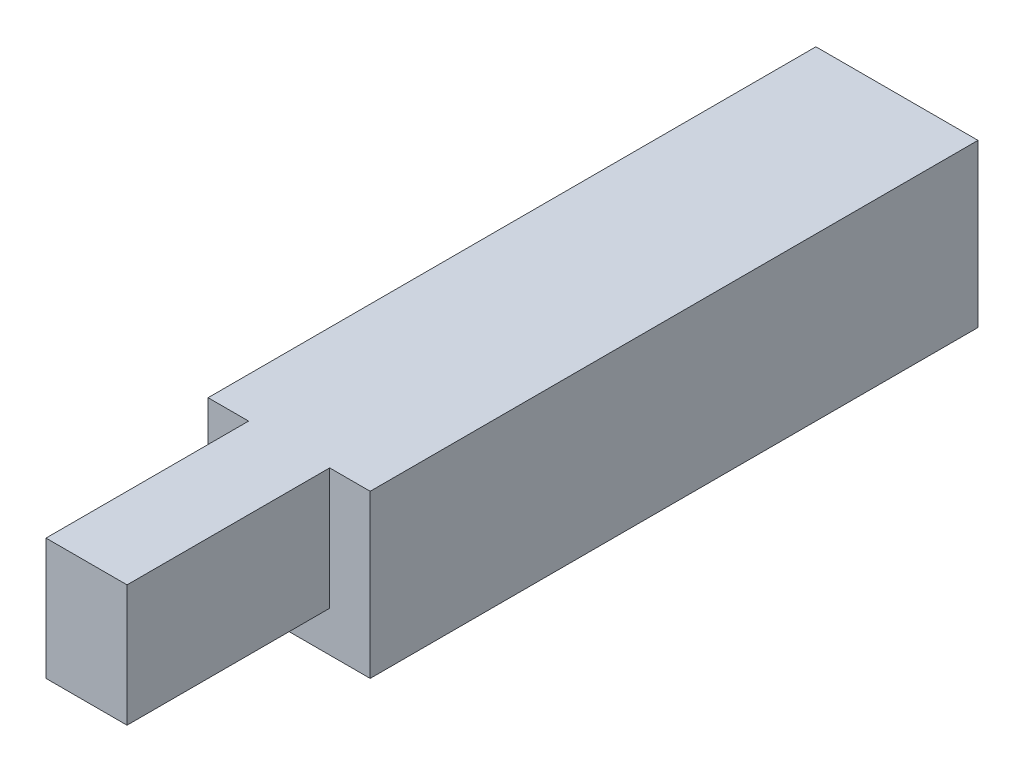
ISO-10303-21;
HEADER;
FILE_DESCRIPTION(('STEP AP214'),'2;1');
FILE_NAME('part.step','',(''),(''),'','','');
FILE_SCHEMA(('AUTOMOTIVE_DESIGN { 1 0 10303 214 1 1 1 1 }'));
ENDSEC;
DATA;
#1=APPLICATION_CONTEXT('core data for automotive mechanical design processes');
#2=APPLICATION_PROTOCOL_DEFINITION('international standard','automotive_design',2000,#1);
#3=PRODUCT_CONTEXT('',#1,'mechanical');
#4=PRODUCT('Part','Part','',(#3));
#5=PRODUCT_RELATED_PRODUCT_CATEGORY('part','',(#4));
#6=PRODUCT_DEFINITION_FORMATION('','',#4);
#7=PRODUCT_DEFINITION_CONTEXT('part definition',#1,'design');
#8=PRODUCT_DEFINITION('design','',#6,#7);
#9=PRODUCT_DEFINITION_SHAPE('','',#8);
#10=(LENGTH_UNIT() NAMED_UNIT(*) SI_UNIT(.MILLI.,.METRE.));
#11=(NAMED_UNIT(*) PLANE_ANGLE_UNIT() SI_UNIT($,.RADIAN.));
#12=(NAMED_UNIT(*) SI_UNIT($,.STERADIAN.) SOLID_ANGLE_UNIT());
#13=UNCERTAINTY_MEASURE_WITH_UNIT(LENGTH_MEASURE(1.E-05),#10,'distance_accuracy_value','');
#14=(GEOMETRIC_REPRESENTATION_CONTEXT(3) GLOBAL_UNCERTAINTY_ASSIGNED_CONTEXT((#13)) GLOBAL_UNIT_ASSIGNED_CONTEXT((#10,
#11,#12)) REPRESENTATION_CONTEXT('',''));
#15=CARTESIAN_POINT('',(0.,0.,0.));
#16=DIRECTION('',(0.,0.,1.));
#17=DIRECTION('',(1.,0.,0.));
#18=AXIS2_PLACEMENT_3D('',#15,#16,#17);
#19=CARTESIAN_POINT('',(0.,0.,37.5));
#20=DIRECTION('',(0.,0.,-1.));
#21=DIRECTION('',(-1.,0.,0.));
#22=AXIS2_PLACEMENT_3D('',#19,#20,#21);
#23=PLANE('',#22);
#24=DIRECTION('',(0.,-1.,0.));
#25=VECTOR('',#24,1.);
#26=CARTESIAN_POINT('',(-2.5,-2.5,37.5));
#27=LINE('',#26,#25);
#28=CARTESIAN_POINT('',(-2.5,5.,37.5));
#29=VERTEX_POINT('',#28);
#30=CARTESIAN_POINT('',(-2.5,-2.5,37.5));
#31=VERTEX_POINT('',#30);
#32=EDGE_CURVE('E57',#29,#31,#27,.T.);
#33=ORIENTED_EDGE('',*,*,#32,.F.);
#34=DIRECTION('',(-1.,0.,0.));
#35=VECTOR('',#34,1.);
#36=CARTESIAN_POINT('',(-5.,5.,37.5));
#37=LINE('',#36,#35);
#38=CARTESIAN_POINT('',(-5.,5.,37.5));
#39=VERTEX_POINT('',#38);
#40=EDGE_CURVE('E134',#29,#39,#37,.T.);
#41=ORIENTED_EDGE('',*,*,#40,.T.);
#42=DIRECTION('',(0.,-1.,0.));
#43=VECTOR('',#42,1.);
#44=CARTESIAN_POINT('',(-5.,-5.,37.5));
#45=LINE('',#44,#43);
#46=CARTESIAN_POINT('',(-5.,-5.,37.5));
#47=VERTEX_POINT('',#46);
#48=EDGE_CURVE('E138',#39,#47,#45,.T.);
#49=ORIENTED_EDGE('',*,*,#48,.T.);
#50=DIRECTION('',(1.,0.,0.));
#51=VECTOR('',#50,1.);
#52=CARTESIAN_POINT('',(-5.,-5.,37.5));
#53=LINE('',#52,#51);
#54=CARTESIAN_POINT('',(5.,-5.,37.5));
#55=VERTEX_POINT('',#54);
#56=EDGE_CURVE('E140',#47,#55,#53,.T.);
#57=ORIENTED_EDGE('',*,*,#56,.T.);
#58=DIRECTION('',(0.,1.,0.));
#59=VECTOR('',#58,1.);
#60=CARTESIAN_POINT('',(5.,-5.,37.5));
#61=LINE('',#60,#59);
#62=CARTESIAN_POINT('',(5.,5.,37.5));
#63=VERTEX_POINT('',#62);
#64=EDGE_CURVE('E131',#55,#63,#61,.T.);
#65=ORIENTED_EDGE('',*,*,#64,.T.);
#66=CARTESIAN_POINT('',(2.5,5.,37.5));
#67=VERTEX_POINT('',#66);
#68=EDGE_CURVE('E136',#63,#67,#37,.T.);
#69=ORIENTED_EDGE('',*,*,#68,.T.);
#70=DIRECTION('',(0.,1.,0.));
#71=VECTOR('',#70,1.);
#72=CARTESIAN_POINT('',(2.5,5.,37.5));
#73=LINE('',#72,#71);
#74=CARTESIAN_POINT('',(2.5,-2.5,37.5));
#75=VERTEX_POINT('',#74);
#76=EDGE_CURVE('E119',#75,#67,#73,.T.);
#77=ORIENTED_EDGE('',*,*,#76,.F.);
#78=DIRECTION('',(1.,0.,0.));
#79=VECTOR('',#78,1.);
#80=CARTESIAN_POINT('',(-2.5,-2.5,37.5));
#81=LINE('',#80,#79);
#82=EDGE_CURVE('E52',#31,#75,#81,.T.);
#83=ORIENTED_EDGE('',*,*,#82,.F.);
#84=EDGE_LOOP('',(#33,#41,#49,#57,#65,#69,#77,#83));
#85=FACE_BOUND('',#84,.T.);
#86=ADVANCED_FACE('F37',(#85),#23,.F.);
#87=CARTESIAN_POINT('',(5.,-5.,37.5));
#88=DIRECTION('',(-1.,0.,0.));
#89=DIRECTION('',(0.,0.,1.));
#90=AXIS2_PLACEMENT_3D('',#87,#88,#89);
#91=PLANE('',#90);
#92=DIRECTION('',(0.,1.,0.));
#93=VECTOR('',#92,1.);
#94=CARTESIAN_POINT('',(5.,-5.,0.));
#95=LINE('',#94,#93);
#96=CARTESIAN_POINT('',(5.,-5.,0.));
#97=VERTEX_POINT('',#96);
#98=CARTESIAN_POINT('',(5.,5.,0.));
#99=VERTEX_POINT('',#98);
#100=EDGE_CURVE('E122',#97,#99,#95,.T.);
#101=ORIENTED_EDGE('',*,*,#100,.T.);
#102=DIRECTION('',(0.,0.,-1.));
#103=VECTOR('',#102,1.);
#104=CARTESIAN_POINT('',(5.,5.,37.5));
#105=LINE('',#104,#103);
#106=EDGE_CURVE('E11',#63,#99,#105,.T.);
#107=ORIENTED_EDGE('',*,*,#106,.F.);
#108=ORIENTED_EDGE('',*,*,#64,.F.);
#109=DIRECTION('',(0.,0.,-1.));
#110=VECTOR('',#109,1.);
#111=CARTESIAN_POINT('',(5.,-5.,37.5));
#112=LINE('',#111,#110);
#113=EDGE_CURVE('E141',#55,#97,#112,.T.);
#114=ORIENTED_EDGE('',*,*,#113,.T.);
#115=EDGE_LOOP('',(#101,#107,#108,#114));
#116=FACE_BOUND('',#115,.T.);
#117=ADVANCED_FACE('F39',(#116),#91,.F.);
#118=CARTESIAN_POINT('',(-5.,5.,37.5));
#119=DIRECTION('',(0.,-1.,0.));
#120=DIRECTION('',(0.,0.,-1.));
#121=AXIS2_PLACEMENT_3D('',#118,#119,#120);
#122=PLANE('',#121);
#123=DIRECTION('',(-1.,0.,0.));
#124=VECTOR('',#123,1.);
#125=CARTESIAN_POINT('',(-5.,5.,0.));
#126=LINE('',#125,#124);
#127=CARTESIAN_POINT('',(-5.,5.,0.));
#128=VERTEX_POINT('',#127);
#129=EDGE_CURVE('E125',#99,#128,#126,.T.);
#130=ORIENTED_EDGE('',*,*,#129,.T.);
#131=DIRECTION('',(0.,0.,-1.));
#132=VECTOR('',#131,1.);
#133=CARTESIAN_POINT('',(-5.,5.,37.5));
#134=LINE('',#133,#132);
#135=EDGE_CURVE('E45',#39,#128,#134,.T.);
#136=ORIENTED_EDGE('',*,*,#135,.F.);
#137=ORIENTED_EDGE('',*,*,#40,.F.);
#138=DIRECTION('',(0.,0.,-1.));
#139=VECTOR('',#138,1.);
#140=CARTESIAN_POINT('',(-2.5,5.,50.));
#141=LINE('',#140,#139);
#142=CARTESIAN_POINT('',(-2.5,5.,50.));
#143=VERTEX_POINT('',#142);
#144=EDGE_CURVE('E172',#143,#29,#141,.T.);
#145=ORIENTED_EDGE('',*,*,#144,.F.);
#146=DIRECTION('',(-1.,0.,0.));
#147=VECTOR('',#146,1.);
#148=CARTESIAN_POINT('',(-2.5,5.,50.));
#149=LINE('',#148,#147);
#150=CARTESIAN_POINT('',(2.5,5.,50.));
#151=VERTEX_POINT('',#150);
#152=EDGE_CURVE('E115',#151,#143,#149,.T.);
#153=ORIENTED_EDGE('',*,*,#152,.F.);
#154=DIRECTION('',(0.,0.,-1.));
#155=VECTOR('',#154,1.);
#156=CARTESIAN_POINT('',(2.5,5.,50.));
#157=LINE('',#156,#155);
#158=EDGE_CURVE('E127',#151,#67,#157,.T.);
#159=ORIENTED_EDGE('',*,*,#158,.T.);
#160=ORIENTED_EDGE('',*,*,#68,.F.);
#161=ORIENTED_EDGE('',*,*,#106,.T.);
#162=EDGE_LOOP('',(#130,#136,#137,#145,#153,#159,#160,#161));
#163=FACE_BOUND('',#162,.T.);
#164=ADVANCED_FACE('F171',(#163),#122,.F.);
#165=CARTESIAN_POINT('',(-5.,-5.,37.5));
#166=DIRECTION('',(1.,0.,0.));
#167=DIRECTION('',(0.,0.,-1.));
#168=AXIS2_PLACEMENT_3D('',#165,#166,#167);
#169=PLANE('',#168);
#170=DIRECTION('',(0.,-1.,0.));
#171=VECTOR('',#170,1.);
#172=CARTESIAN_POINT('',(-5.,-5.,0.));
#173=LINE('',#172,#171);
#174=CARTESIAN_POINT('',(-5.,-5.,0.));
#175=VERTEX_POINT('',#174);
#176=EDGE_CURVE('E144',#128,#175,#173,.T.);
#177=ORIENTED_EDGE('',*,*,#176,.T.);
#178=DIRECTION('',(0.,0.,-1.));
#179=VECTOR('',#178,1.);
#180=CARTESIAN_POINT('',(-5.,-5.,37.5));
#181=LINE('',#180,#179);
#182=EDGE_CURVE('E149',#47,#175,#181,.T.);
#183=ORIENTED_EDGE('',*,*,#182,.F.);
#184=ORIENTED_EDGE('',*,*,#48,.F.);
#185=ORIENTED_EDGE('',*,*,#135,.T.);
#186=EDGE_LOOP('',(#177,#183,#184,#185));
#187=FACE_BOUND('',#186,.T.);
#188=ADVANCED_FACE('F156',(#187),#169,.F.);
#189=CARTESIAN_POINT('',(-5.,-5.,37.5));
#190=DIRECTION('',(0.,1.,0.));
#191=DIRECTION('',(0.,0.,1.));
#192=AXIS2_PLACEMENT_3D('',#189,#190,#191);
#193=PLANE('',#192);
#194=DIRECTION('',(1.,0.,0.));
#195=VECTOR('',#194,1.);
#196=CARTESIAN_POINT('',(-5.,-5.,0.));
#197=LINE('',#196,#195);
#198=EDGE_CURVE('E135',#175,#97,#197,.T.);
#199=ORIENTED_EDGE('',*,*,#198,.T.);
#200=ORIENTED_EDGE('',*,*,#113,.F.);
#201=ORIENTED_EDGE('',*,*,#56,.F.);
#202=ORIENTED_EDGE('',*,*,#182,.T.);
#203=EDGE_LOOP('',(#199,#200,#201,#202));
#204=FACE_BOUND('',#203,.T.);
#205=ADVANCED_FACE('F165',(#204),#193,.F.);
#206=CARTESIAN_POINT('',(0.,0.,0.));
#207=DIRECTION('',(0.,0.,-1.));
#208=DIRECTION('',(-1.,0.,0.));
#209=AXIS2_PLACEMENT_3D('',#206,#207,#208);
#210=PLANE('',#209);
#211=ORIENTED_EDGE('',*,*,#100,.F.);
#212=ORIENTED_EDGE('',*,*,#198,.F.);
#213=ORIENTED_EDGE('',*,*,#176,.F.);
#214=ORIENTED_EDGE('',*,*,#129,.F.);
#215=EDGE_LOOP('',(#211,#212,#213,#214));
#216=FACE_BOUND('',#215,.T.);
#217=ADVANCED_FACE('F162',(#216),#210,.T.);
#218=CARTESIAN_POINT('',(-2.5,-2.5,50.));
#219=DIRECTION('',(1.,0.,0.));
#220=DIRECTION('',(0.,1.,0.));
#221=AXIS2_PLACEMENT_3D('',#218,#219,#220);
#222=PLANE('',#221);
#223=ORIENTED_EDGE('',*,*,#32,.T.);
#224=DIRECTION('',(0.,0.,-1.));
#225=VECTOR('',#224,1.);
#226=CARTESIAN_POINT('',(-2.5,-2.5,50.));
#227=LINE('',#226,#225);
#228=CARTESIAN_POINT('',(-2.5,-2.5,50.));
#229=VERTEX_POINT('',#228);
#230=EDGE_CURVE('E104',#229,#31,#227,.T.);
#231=ORIENTED_EDGE('',*,*,#230,.F.);
#232=DIRECTION('',(0.,-1.,0.));
#233=VECTOR('',#232,1.);
#234=CARTESIAN_POINT('',(-2.5,-2.5,50.));
#235=LINE('',#234,#233);
#236=EDGE_CURVE('E110',#143,#229,#235,.T.);
#237=ORIENTED_EDGE('',*,*,#236,.F.);
#238=ORIENTED_EDGE('',*,*,#144,.T.);
#239=EDGE_LOOP('',(#223,#231,#237,#238));
#240=FACE_BOUND('',#239,.T.);
#241=ADVANCED_FACE('F121',(#240),#222,.F.);
#242=CARTESIAN_POINT('',(-2.5,-2.5,50.));
#243=DIRECTION('',(0.,1.,0.));
#244=DIRECTION('',(0.,0.,1.));
#245=AXIS2_PLACEMENT_3D('',#242,#243,#244);
#246=PLANE('',#245);
#247=ORIENTED_EDGE('',*,*,#82,.T.);
#248=DIRECTION('',(0.,0.,-1.));
#249=VECTOR('',#248,1.);
#250=CARTESIAN_POINT('',(2.5,-2.5,50.));
#251=LINE('',#250,#249);
#252=CARTESIAN_POINT('',(2.5,-2.5,50.));
#253=VERTEX_POINT('',#252);
#254=EDGE_CURVE('E106',#253,#75,#251,.T.);
#255=ORIENTED_EDGE('',*,*,#254,.F.);
#256=DIRECTION('',(1.,0.,0.));
#257=VECTOR('',#256,1.);
#258=CARTESIAN_POINT('',(-2.5,-2.5,50.));
#259=LINE('',#258,#257);
#260=EDGE_CURVE('E100',#229,#253,#259,.T.);
#261=ORIENTED_EDGE('',*,*,#260,.F.);
#262=ORIENTED_EDGE('',*,*,#230,.T.);
#263=EDGE_LOOP('',(#247,#255,#261,#262));
#264=FACE_BOUND('',#263,.T.);
#265=ADVANCED_FACE('F102',(#264),#246,.F.);
#266=CARTESIAN_POINT('',(2.5,5.,50.));
#267=DIRECTION('',(-1.,0.,0.));
#268=DIRECTION('',(0.,0.,1.));
#269=AXIS2_PLACEMENT_3D('',#266,#267,#268);
#270=PLANE('',#269);
#271=ORIENTED_EDGE('',*,*,#76,.T.);
#272=ORIENTED_EDGE('',*,*,#158,.F.);
#273=DIRECTION('',(0.,1.,0.));
#274=VECTOR('',#273,1.);
#275=CARTESIAN_POINT('',(2.5,5.,50.));
#276=LINE('',#275,#274);
#277=EDGE_CURVE('E109',#253,#151,#276,.T.);
#278=ORIENTED_EDGE('',*,*,#277,.F.);
#279=ORIENTED_EDGE('',*,*,#254,.T.);
#280=EDGE_LOOP('',(#271,#272,#278,#279));
#281=FACE_BOUND('',#280,.T.);
#282=ADVANCED_FACE('F182',(#281),#270,.F.);
#283=CARTESIAN_POINT('',(0.,0.,50.));
#284=DIRECTION('',(0.,0.,-1.));
#285=DIRECTION('',(-1.,0.,0.));
#286=AXIS2_PLACEMENT_3D('',#283,#284,#285);
#287=PLANE('',#286);
#288=ORIENTED_EDGE('',*,*,#236,.T.);
#289=ORIENTED_EDGE('',*,*,#260,.T.);
#290=ORIENTED_EDGE('',*,*,#277,.T.);
#291=ORIENTED_EDGE('',*,*,#152,.T.);
#292=EDGE_LOOP('',(#288,#289,#290,#291));
#293=FACE_BOUND('',#292,.T.);
#294=ADVANCED_FACE('F113',(#293),#287,.F.);
#295=CLOSED_SHELL('',(#86,#117,#164,#188,#205,#217,#241,#265,#282,#294));
#296=MANIFOLD_SOLID_BREP('B2',#295);
#297=ADVANCED_BREP_SHAPE_REPRESENTATION('',(#18,#296),#14);
#298=SHAPE_DEFINITION_REPRESENTATION(#9,#297);
ENDSEC;
END-ISO-10303-21;
